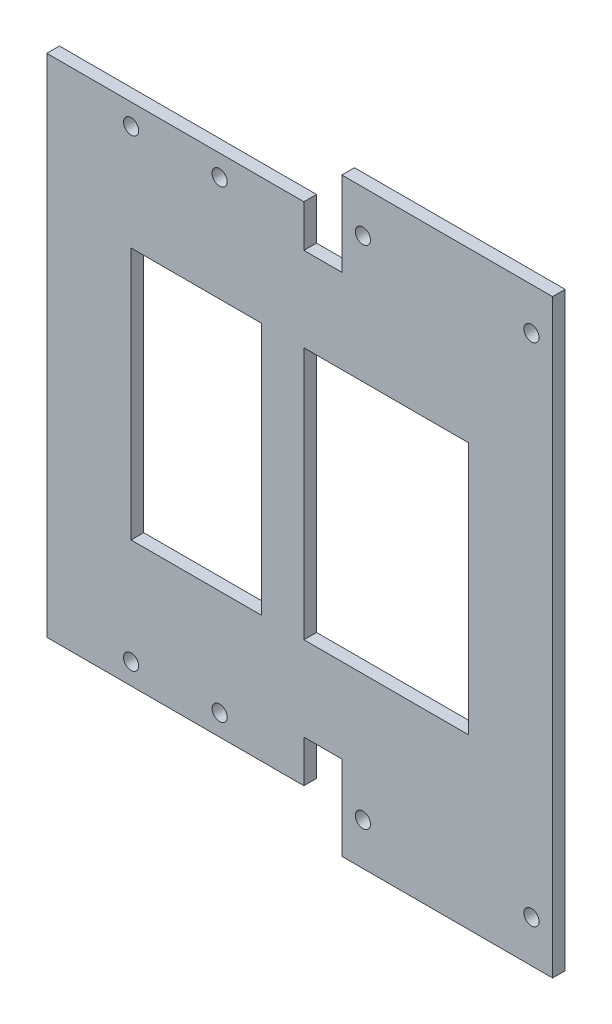
ISO-10303-21;
HEADER;
FILE_DESCRIPTION(('STEP AP214'),'2;1');
FILE_NAME('part.step','',(''),(''),'','','');
FILE_SCHEMA(('AUTOMOTIVE_DESIGN { 1 0 10303 214 1 1 1 1 }'));
ENDSEC;
DATA;
#1=APPLICATION_CONTEXT('core data for automotive mechanical design processes');
#2=APPLICATION_PROTOCOL_DEFINITION('international standard','automotive_design',2000,#1);
#3=PRODUCT_CONTEXT('',#1,'mechanical');
#4=PRODUCT('Part','Part','',(#3));
#5=PRODUCT_RELATED_PRODUCT_CATEGORY('part','',(#4));
#6=PRODUCT_DEFINITION_FORMATION('','',#4);
#7=PRODUCT_DEFINITION_CONTEXT('part definition',#1,'design');
#8=PRODUCT_DEFINITION('design','',#6,#7);
#9=PRODUCT_DEFINITION_SHAPE('','',#8);
#10=(LENGTH_UNIT() NAMED_UNIT(*) SI_UNIT(.MILLI.,.METRE.));
#11=(NAMED_UNIT(*) PLANE_ANGLE_UNIT() SI_UNIT($,.RADIAN.));
#12=(NAMED_UNIT(*) SI_UNIT($,.STERADIAN.) SOLID_ANGLE_UNIT());
#13=UNCERTAINTY_MEASURE_WITH_UNIT(LENGTH_MEASURE(1.E-05),#10,'distance_accuracy_value','');
#14=(GEOMETRIC_REPRESENTATION_CONTEXT(3) GLOBAL_UNCERTAINTY_ASSIGNED_CONTEXT((#13)) GLOBAL_UNIT_ASSIGNED_CONTEXT((#10,
#11,#12)) REPRESENTATION_CONTEXT('',''));
#15=CARTESIAN_POINT('',(0.,0.,0.));
#16=DIRECTION('',(0.,0.,1.));
#17=DIRECTION('',(1.,0.,0.));
#18=AXIS2_PLACEMENT_3D('',#15,#16,#17);
#19=CARTESIAN_POINT('',(20.,0.,3.));
#20=DIRECTION('',(-1.,0.,0.));
#21=DIRECTION('',(0.,-1.,0.));
#22=AXIS2_PLACEMENT_3D('',#19,#20,#21);
#23=PLANE('',#22);
#24=DIRECTION('',(0.,1.,0.));
#25=VECTOR('',#24,1.);
#26=CARTESIAN_POINT('',(20.,0.,0.));
#27=LINE('',#26,#25);
#28=CARTESIAN_POINT('',(20.,20.,0.));
#29=VERTEX_POINT('',#28);
#30=CARTESIAN_POINT('',(20.,80.,0.));
#31=VERTEX_POINT('',#30);
#32=EDGE_CURVE('E314',#29,#31,#27,.T.);
#33=ORIENTED_EDGE('',*,*,#32,.T.);
#34=DIRECTION('',(0.,0.,-1.));
#35=VECTOR('',#34,1.);
#36=CARTESIAN_POINT('',(20.,80.,3.));
#37=LINE('',#36,#35);
#38=CARTESIAN_POINT('',(20.,80.,3.));
#39=VERTEX_POINT('',#38);
#40=EDGE_CURVE('E11',#39,#31,#37,.T.);
#41=ORIENTED_EDGE('',*,*,#40,.F.);
#42=DIRECTION('',(0.,1.,0.));
#43=VECTOR('',#42,1.);
#44=CARTESIAN_POINT('',(20.,0.,3.));
#45=LINE('',#44,#43);
#46=CARTESIAN_POINT('',(20.,20.,3.));
#47=VERTEX_POINT('',#46);
#48=EDGE_CURVE('E198',#47,#39,#45,.T.);
#49=ORIENTED_EDGE('',*,*,#48,.F.);
#50=DIRECTION('',(0.,0.,-1.));
#51=VECTOR('',#50,1.);
#52=CARTESIAN_POINT('',(20.,20.,3.));
#53=LINE('',#52,#51);
#54=EDGE_CURVE('E65',#47,#29,#53,.T.);
#55=ORIENTED_EDGE('',*,*,#54,.T.);
#56=EDGE_LOOP('',(#33,#41,#49,#55));
#57=FACE_BOUND('',#56,.T.);
#58=ADVANCED_FACE('F45',(#57),#23,.F.);
#59=CARTESIAN_POINT('',(0.,80.,3.));
#60=DIRECTION('',(0.,1.,0.));
#61=DIRECTION('',(0.,0.,1.));
#62=AXIS2_PLACEMENT_3D('',#59,#60,#61);
#63=PLANE('',#62);
#64=DIRECTION('',(1.,0.,0.));
#65=VECTOR('',#64,1.);
#66=CARTESIAN_POINT('',(0.,80.,0.));
#67=LINE('',#66,#65);
#68=CARTESIAN_POINT('',(51.,80.,0.));
#69=VERTEX_POINT('',#68);
#70=EDGE_CURVE('E205',#31,#69,#67,.T.);
#71=ORIENTED_EDGE('',*,*,#70,.T.);
#72=DIRECTION('',(0.,0.,-1.));
#73=VECTOR('',#72,1.);
#74=CARTESIAN_POINT('',(51.,80.,3.));
#75=LINE('',#74,#73);
#76=CARTESIAN_POINT('',(51.,80.,3.));
#77=VERTEX_POINT('',#76);
#78=EDGE_CURVE('E56',#77,#69,#75,.T.);
#79=ORIENTED_EDGE('',*,*,#78,.F.);
#80=DIRECTION('',(1.,0.,0.));
#81=VECTOR('',#80,1.);
#82=CARTESIAN_POINT('',(0.,80.,3.));
#83=LINE('',#82,#81);
#84=EDGE_CURVE('E191',#39,#77,#83,.T.);
#85=ORIENTED_EDGE('',*,*,#84,.F.);
#86=ORIENTED_EDGE('',*,*,#40,.T.);
#87=EDGE_LOOP('',(#71,#79,#85,#86));
#88=FACE_BOUND('',#87,.T.);
#89=ADVANCED_FACE('F204',(#88),#63,.F.);
#90=CARTESIAN_POINT('',(51.,0.,3.));
#91=DIRECTION('',(-1.,0.,0.));
#92=DIRECTION('',(0.,-1.,0.));
#93=AXIS2_PLACEMENT_3D('',#90,#91,#92);
#94=PLANE('',#93);
#95=DIRECTION('',(0.,1.,0.));
#96=VECTOR('',#95,1.);
#97=CARTESIAN_POINT('',(51.,0.,0.));
#98=LINE('',#97,#96);
#99=CARTESIAN_POINT('',(51.,20.,0.));
#100=VERTEX_POINT('',#99);
#101=EDGE_CURVE('E319',#100,#69,#98,.T.);
#102=ORIENTED_EDGE('',*,*,#101,.F.);
#103=DIRECTION('',(0.,0.,-1.));
#104=VECTOR('',#103,1.);
#105=CARTESIAN_POINT('',(51.,20.,3.));
#106=LINE('',#105,#104);
#107=CARTESIAN_POINT('',(51.,20.,3.));
#108=VERTEX_POINT('',#107);
#109=EDGE_CURVE('E127',#108,#100,#106,.T.);
#110=ORIENTED_EDGE('',*,*,#109,.F.);
#111=DIRECTION('',(0.,1.,0.));
#112=VECTOR('',#111,1.);
#113=CARTESIAN_POINT('',(51.,0.,3.));
#114=LINE('',#113,#112);
#115=EDGE_CURVE('E197',#108,#77,#114,.T.);
#116=ORIENTED_EDGE('',*,*,#115,.T.);
#117=ORIENTED_EDGE('',*,*,#78,.T.);
#118=EDGE_LOOP('',(#102,#110,#116,#117));
#119=FACE_BOUND('',#118,.T.);
#120=ADVANCED_FACE('F210',(#119),#94,.T.);
#121=CARTESIAN_POINT('',(0.,100.,3.));
#122=DIRECTION('',(0.,1.,0.));
#123=DIRECTION('',(0.,0.,1.));
#124=AXIS2_PLACEMENT_3D('',#121,#122,#123);
#125=PLANE('',#124);
#126=DIRECTION('',(1.,0.,0.));
#127=VECTOR('',#126,1.);
#128=CARTESIAN_POINT('',(0.,100.,0.));
#129=LINE('',#128,#127);
#130=CARTESIAN_POINT('',(61.,100.,0.));
#131=VERTEX_POINT('',#130);
#132=CARTESIAN_POINT('',(70.,100.,0.));
#133=VERTEX_POINT('',#132);
#134=EDGE_CURVE('E266',#131,#133,#129,.T.);
#135=ORIENTED_EDGE('',*,*,#134,.F.);
#136=DIRECTION('',(0.,0.,-1.));
#137=VECTOR('',#136,1.);
#138=CARTESIAN_POINT('',(61.,100.,3.));
#139=LINE('',#138,#137);
#140=CARTESIAN_POINT('',(61.,100.,3.));
#141=VERTEX_POINT('',#140);
#142=EDGE_CURVE('E361',#141,#131,#139,.T.);
#143=ORIENTED_EDGE('',*,*,#142,.F.);
#144=DIRECTION('',(1.,0.,0.));
#145=VECTOR('',#144,1.);
#146=CARTESIAN_POINT('',(0.,100.,3.));
#147=LINE('',#146,#145);
#148=CARTESIAN_POINT('',(70.,100.,3.));
#149=VERTEX_POINT('',#148);
#150=EDGE_CURVE('E431',#141,#149,#147,.T.);
#151=ORIENTED_EDGE('',*,*,#150,.T.);
#152=DIRECTION('',(0.,0.,-1.));
#153=VECTOR('',#152,1.);
#154=CARTESIAN_POINT('',(70.,100.,3.));
#155=LINE('',#154,#153);
#156=EDGE_CURVE('E364',#149,#133,#155,.T.);
#157=ORIENTED_EDGE('',*,*,#156,.T.);
#158=EDGE_LOOP('',(#135,#143,#151,#157));
#159=FACE_BOUND('',#158,.T.);
#160=ADVANCED_FACE('F498',(#159),#125,.T.);
#161=CARTESIAN_POINT('',(61.,0.,3.));
#162=DIRECTION('',(-1.,0.,0.));
#163=DIRECTION('',(0.,0.,1.));
#164=AXIS2_PLACEMENT_3D('',#161,#162,#163);
#165=PLANE('',#164);
#166=DIRECTION('',(0.,1.,0.));
#167=VECTOR('',#166,1.);
#168=CARTESIAN_POINT('',(61.,0.,0.));
#169=LINE('',#168,#167);
#170=CARTESIAN_POINT('',(61.,110.,0.));
#171=VERTEX_POINT('',#170);
#172=EDGE_CURVE('E270',#131,#171,#169,.T.);
#173=ORIENTED_EDGE('',*,*,#172,.T.);
#174=DIRECTION('',(0.,0.,-1.));
#175=VECTOR('',#174,1.);
#176=CARTESIAN_POINT('',(61.,110.,3.));
#177=LINE('',#176,#175);
#178=CARTESIAN_POINT('',(61.,110.,3.));
#179=VERTEX_POINT('',#178);
#180=EDGE_CURVE('E396',#179,#171,#177,.T.);
#181=ORIENTED_EDGE('',*,*,#180,.F.);
#182=DIRECTION('',(0.,1.,0.));
#183=VECTOR('',#182,1.);
#184=CARTESIAN_POINT('',(61.,0.,3.));
#185=LINE('',#184,#183);
#186=EDGE_CURVE('E437',#141,#179,#185,.T.);
#187=ORIENTED_EDGE('',*,*,#186,.F.);
#188=ORIENTED_EDGE('',*,*,#142,.T.);
#189=EDGE_LOOP('',(#173,#181,#187,#188));
#190=FACE_BOUND('',#189,.T.);
#191=ADVANCED_FACE('F502',(#190),#165,.F.);
#192=CARTESIAN_POINT('',(0.,110.,3.));
#193=DIRECTION('',(0.,1.,0.));
#194=DIRECTION('',(0.,0.,1.));
#195=AXIS2_PLACEMENT_3D('',#192,#193,#194);
#196=PLANE('',#195);
#197=DIRECTION('',(1.,0.,0.));
#198=VECTOR('',#197,1.);
#199=CARTESIAN_POINT('',(0.,110.,0.));
#200=LINE('',#199,#198);
#201=CARTESIAN_POINT('',(0.,110.,0.));
#202=VERTEX_POINT('',#201);
#203=EDGE_CURVE('E274',#202,#171,#200,.T.);
#204=ORIENTED_EDGE('',*,*,#203,.F.);
#205=DIRECTION('',(0.,0.,-1.));
#206=VECTOR('',#205,1.);
#207=CARTESIAN_POINT('',(0.,110.,3.));
#208=LINE('',#207,#206);
#209=CARTESIAN_POINT('',(0.,110.,3.));
#210=VERTEX_POINT('',#209);
#211=EDGE_CURVE('E393',#210,#202,#208,.T.);
#212=ORIENTED_EDGE('',*,*,#211,.F.);
#213=DIRECTION('',(1.,0.,0.));
#214=VECTOR('',#213,1.);
#215=CARTESIAN_POINT('',(0.,110.,3.));
#216=LINE('',#215,#214);
#217=EDGE_CURVE('E444',#210,#179,#216,.T.);
#218=ORIENTED_EDGE('',*,*,#217,.T.);
#219=ORIENTED_EDGE('',*,*,#180,.T.);
#220=EDGE_LOOP('',(#204,#212,#218,#219));
#221=FACE_BOUND('',#220,.T.);
#222=ADVANCED_FACE('F532',(#221),#196,.T.);
#223=CARTESIAN_POINT('',(0.,0.,3.));
#224=DIRECTION('',(-1.,0.,0.));
#225=DIRECTION('',(0.,-1.,0.));
#226=AXIS2_PLACEMENT_3D('',#223,#224,#225);
#227=PLANE('',#226);
#228=DIRECTION('',(0.,1.,0.));
#229=VECTOR('',#228,1.);
#230=CARTESIAN_POINT('',(0.,0.,0.));
#231=LINE('',#230,#229);
#232=CARTESIAN_POINT('',(0.,-10.,0.));
#233=VERTEX_POINT('',#232);
#234=EDGE_CURVE('E278',#233,#202,#231,.T.);
#235=ORIENTED_EDGE('',*,*,#234,.F.);
#236=DIRECTION('',(0.,0.,-1.));
#237=VECTOR('',#236,1.);
#238=CARTESIAN_POINT('',(0.,-10.,3.));
#239=LINE('',#238,#237);
#240=CARTESIAN_POINT('',(0.,-10.,3.));
#241=VERTEX_POINT('',#240);
#242=EDGE_CURVE('E390',#241,#233,#239,.T.);
#243=ORIENTED_EDGE('',*,*,#242,.F.);
#244=DIRECTION('',(0.,1.,0.));
#245=VECTOR('',#244,1.);
#246=CARTESIAN_POINT('',(0.,0.,3.));
#247=LINE('',#246,#245);
#248=EDGE_CURVE('E448',#241,#210,#247,.T.);
#249=ORIENTED_EDGE('',*,*,#248,.T.);
#250=ORIENTED_EDGE('',*,*,#211,.T.);
#251=EDGE_LOOP('',(#235,#243,#249,#250));
#252=FACE_BOUND('',#251,.T.);
#253=ADVANCED_FACE('F508',(#252),#227,.T.);
#254=CARTESIAN_POINT('',(0.,-10.,3.));
#255=DIRECTION('',(0.,1.,0.));
#256=DIRECTION('',(-1.,0.,0.));
#257=AXIS2_PLACEMENT_3D('',#254,#255,#256);
#258=PLANE('',#257);
#259=DIRECTION('',(1.,0.,0.));
#260=VECTOR('',#259,1.);
#261=CARTESIAN_POINT('',(0.,-10.,0.));
#262=LINE('',#261,#260);
#263=CARTESIAN_POINT('',(61.,-9.99999999999998,0.));
#264=VERTEX_POINT('',#263);
#265=EDGE_CURVE('E282',#233,#264,#262,.T.);
#266=ORIENTED_EDGE('',*,*,#265,.T.);
#267=DIRECTION('',(0.,0.,-1.));
#268=VECTOR('',#267,1.);
#269=CARTESIAN_POINT('',(61.,-9.99999999999998,3.));
#270=LINE('',#269,#268);
#271=CARTESIAN_POINT('',(61.,-9.99999999999998,3.));
#272=VERTEX_POINT('',#271);
#273=EDGE_CURVE('E387',#272,#264,#270,.T.);
#274=ORIENTED_EDGE('',*,*,#273,.F.);
#275=DIRECTION('',(1.,0.,0.));
#276=VECTOR('',#275,1.);
#277=CARTESIAN_POINT('',(0.,-10.,3.));
#278=LINE('',#277,#276);
#279=EDGE_CURVE('E452',#241,#272,#278,.T.);
#280=ORIENTED_EDGE('',*,*,#279,.F.);
#281=ORIENTED_EDGE('',*,*,#242,.T.);
#282=EDGE_LOOP('',(#266,#274,#280,#281));
#283=FACE_BOUND('',#282,.T.);
#284=ADVANCED_FACE('F514',(#283),#258,.F.);
#285=CARTESIAN_POINT('',(61.,0.,3.));
#286=DIRECTION('',(1.,0.,0.));
#287=DIRECTION('',(0.,0.,-1.));
#288=AXIS2_PLACEMENT_3D('',#285,#286,#287);
#289=PLANE('',#288);
#290=DIRECTION('',(0.,-1.,0.));
#291=VECTOR('',#290,1.);
#292=CARTESIAN_POINT('',(61.,0.,0.));
#293=LINE('',#292,#291);
#294=CARTESIAN_POINT('',(61.,0.,0.));
#295=VERTEX_POINT('',#294);
#296=EDGE_CURVE('E286',#295,#264,#293,.T.);
#297=ORIENTED_EDGE('',*,*,#296,.F.);
#298=DIRECTION('',(0.,0.,-1.));
#299=VECTOR('',#298,1.);
#300=CARTESIAN_POINT('',(61.,0.,3.));
#301=LINE('',#300,#299);
#302=CARTESIAN_POINT('',(61.,0.,3.));
#303=VERTEX_POINT('',#302);
#304=EDGE_CURVE('E384',#303,#295,#301,.T.);
#305=ORIENTED_EDGE('',*,*,#304,.F.);
#306=DIRECTION('',(0.,-1.,0.));
#307=VECTOR('',#306,1.);
#308=CARTESIAN_POINT('',(61.,0.,3.));
#309=LINE('',#308,#307);
#310=EDGE_CURVE('E455',#303,#272,#309,.T.);
#311=ORIENTED_EDGE('',*,*,#310,.T.);
#312=ORIENTED_EDGE('',*,*,#273,.T.);
#313=EDGE_LOOP('',(#297,#305,#311,#312));
#314=FACE_BOUND('',#313,.T.);
#315=ADVANCED_FACE('F520',(#314),#289,.T.);
#316=CARTESIAN_POINT('',(0.,0.,3.));
#317=DIRECTION('',(0.,1.,0.));
#318=DIRECTION('',(-1.,0.,0.));
#319=AXIS2_PLACEMENT_3D('',#316,#317,#318);
#320=PLANE('',#319);
#321=DIRECTION('',(1.,0.,0.));
#322=VECTOR('',#321,1.);
#323=CARTESIAN_POINT('',(0.,0.,0.));
#324=LINE('',#323,#322);
#325=CARTESIAN_POINT('',(70.,0.,0.));
#326=VERTEX_POINT('',#325);
#327=EDGE_CURVE('E290',#295,#326,#324,.T.);
#328=ORIENTED_EDGE('',*,*,#327,.T.);
#329=DIRECTION('',(0.,0.,-1.));
#330=VECTOR('',#329,1.);
#331=CARTESIAN_POINT('',(70.,0.,3.));
#332=LINE('',#331,#330);
#333=CARTESIAN_POINT('',(70.,0.,3.));
#334=VERTEX_POINT('',#333);
#335=EDGE_CURVE('E380',#334,#326,#332,.T.);
#336=ORIENTED_EDGE('',*,*,#335,.F.);
#337=DIRECTION('',(1.,0.,0.));
#338=VECTOR('',#337,1.);
#339=CARTESIAN_POINT('',(0.,0.,3.));
#340=LINE('',#339,#338);
#341=EDGE_CURVE('E459',#303,#334,#340,.T.);
#342=ORIENTED_EDGE('',*,*,#341,.F.);
#343=ORIENTED_EDGE('',*,*,#304,.T.);
#344=EDGE_LOOP('',(#328,#336,#342,#343));
#345=FACE_BOUND('',#344,.T.);
#346=ADVANCED_FACE('F523',(#345),#320,.F.);
#347=CARTESIAN_POINT('',(70.,0.,3.));
#348=DIRECTION('',(1.,0.,0.));
#349=DIRECTION('',(0.,1.,0.));
#350=AXIS2_PLACEMENT_3D('',#347,#348,#349);
#351=PLANE('',#350);
#352=DIRECTION('',(0.,-1.,0.));
#353=VECTOR('',#352,1.);
#354=CARTESIAN_POINT('',(70.,0.,0.));
#355=LINE('',#354,#353);
#356=CARTESIAN_POINT('',(70.,-20.,0.));
#357=VERTEX_POINT('',#356);
#358=EDGE_CURVE('E294',#326,#357,#355,.T.);
#359=ORIENTED_EDGE('',*,*,#358,.T.);
#360=DIRECTION('',(0.,0.,-1.));
#361=VECTOR('',#360,1.);
#362=CARTESIAN_POINT('',(70.,-20.,3.));
#363=LINE('',#362,#361);
#364=CARTESIAN_POINT('',(70.,-20.,3.));
#365=VERTEX_POINT('',#364);
#366=EDGE_CURVE('E377',#365,#357,#363,.T.);
#367=ORIENTED_EDGE('',*,*,#366,.F.);
#368=DIRECTION('',(0.,-1.,0.));
#369=VECTOR('',#368,1.);
#370=CARTESIAN_POINT('',(70.,0.,3.));
#371=LINE('',#370,#369);
#372=EDGE_CURVE('E463',#334,#365,#371,.T.);
#373=ORIENTED_EDGE('',*,*,#372,.F.);
#374=ORIENTED_EDGE('',*,*,#335,.T.);
#375=EDGE_LOOP('',(#359,#367,#373,#374));
#376=FACE_BOUND('',#375,.T.);
#377=ADVANCED_FACE('F525',(#376),#351,.F.);
#378=CARTESIAN_POINT('',(0.,-20.,3.));
#379=DIRECTION('',(0.,-1.,0.));
#380=DIRECTION('',(1.,0.,0.));
#381=AXIS2_PLACEMENT_3D('',#378,#379,#380);
#382=PLANE('',#381);
#383=DIRECTION('',(-1.,0.,0.));
#384=VECTOR('',#383,1.);
#385=CARTESIAN_POINT('',(0.,-20.,0.));
#386=LINE('',#385,#384);
#387=CARTESIAN_POINT('',(120.,-20.,0.));
#388=VERTEX_POINT('',#387);
#389=EDGE_CURVE('E298',#388,#357,#386,.T.);
#390=ORIENTED_EDGE('',*,*,#389,.F.);
#391=DIRECTION('',(0.,0.,-1.));
#392=VECTOR('',#391,1.);
#393=CARTESIAN_POINT('',(120.,-20.,3.));
#394=LINE('',#393,#392);
#395=CARTESIAN_POINT('',(120.,-20.,3.));
#396=VERTEX_POINT('',#395);
#397=EDGE_CURVE('E374',#396,#388,#394,.T.);
#398=ORIENTED_EDGE('',*,*,#397,.F.);
#399=DIRECTION('',(-1.,0.,0.));
#400=VECTOR('',#399,1.);
#401=CARTESIAN_POINT('',(0.,-20.,3.));
#402=LINE('',#401,#400);
#403=EDGE_CURVE('E466',#396,#365,#402,.T.);
#404=ORIENTED_EDGE('',*,*,#403,.T.);
#405=ORIENTED_EDGE('',*,*,#366,.T.);
#406=EDGE_LOOP('',(#390,#398,#404,#405));
#407=FACE_BOUND('',#406,.T.);
#408=ADVANCED_FACE('F529',(#407),#382,.T.);
#409=CARTESIAN_POINT('',(120.,0.,3.));
#410=DIRECTION('',(-1.,0.,0.));
#411=DIRECTION('',(0.,-1.,0.));
#412=AXIS2_PLACEMENT_3D('',#409,#410,#411);
#413=PLANE('',#412);
#414=DIRECTION('',(0.,1.,0.));
#415=VECTOR('',#414,1.);
#416=CARTESIAN_POINT('',(120.,0.,0.));
#417=LINE('',#416,#415);
#418=CARTESIAN_POINT('',(120.,120.,0.));
#419=VERTEX_POINT('',#418);
#420=EDGE_CURVE('E302',#388,#419,#417,.T.);
#421=ORIENTED_EDGE('',*,*,#420,.T.);
#422=DIRECTION('',(0.,0.,-1.));
#423=VECTOR('',#422,1.);
#424=CARTESIAN_POINT('',(120.,120.,3.));
#425=LINE('',#424,#423);
#426=CARTESIAN_POINT('',(120.,120.,3.));
#427=VERTEX_POINT('',#426);
#428=EDGE_CURVE('E370',#427,#419,#425,.T.);
#429=ORIENTED_EDGE('',*,*,#428,.F.);
#430=DIRECTION('',(0.,1.,0.));
#431=VECTOR('',#430,1.);
#432=CARTESIAN_POINT('',(120.,0.,3.));
#433=LINE('',#432,#431);
#434=EDGE_CURVE('E470',#396,#427,#433,.T.);
#435=ORIENTED_EDGE('',*,*,#434,.F.);
#436=ORIENTED_EDGE('',*,*,#397,.T.);
#437=EDGE_LOOP('',(#421,#429,#435,#436));
#438=FACE_BOUND('',#437,.T.);
#439=ADVANCED_FACE('F531',(#438),#413,.F.);
#440=CARTESIAN_POINT('',(0.,120.,3.));
#441=DIRECTION('',(0.,-1.,0.));
#442=DIRECTION('',(1.,0.,0.));
#443=AXIS2_PLACEMENT_3D('',#440,#441,#442);
#444=PLANE('',#443);
#445=DIRECTION('',(-1.,0.,0.));
#446=VECTOR('',#445,1.);
#447=CARTESIAN_POINT('',(0.,120.,0.));
#448=LINE('',#447,#446);
#449=CARTESIAN_POINT('',(70.,120.,0.));
#450=VERTEX_POINT('',#449);
#451=EDGE_CURVE('E306',#419,#450,#448,.T.);
#452=ORIENTED_EDGE('',*,*,#451,.T.);
#453=DIRECTION('',(0.,0.,-1.));
#454=VECTOR('',#453,1.);
#455=CARTESIAN_POINT('',(70.,120.,3.));
#456=LINE('',#455,#454);
#457=CARTESIAN_POINT('',(70.,120.,3.));
#458=VERTEX_POINT('',#457);
#459=EDGE_CURVE('E367',#458,#450,#456,.T.);
#460=ORIENTED_EDGE('',*,*,#459,.F.);
#461=DIRECTION('',(-1.,0.,0.));
#462=VECTOR('',#461,1.);
#463=CARTESIAN_POINT('',(0.,120.,3.));
#464=LINE('',#463,#462);
#465=EDGE_CURVE('E474',#427,#458,#464,.T.);
#466=ORIENTED_EDGE('',*,*,#465,.F.);
#467=ORIENTED_EDGE('',*,*,#428,.T.);
#468=EDGE_LOOP('',(#452,#460,#466,#467));
#469=FACE_BOUND('',#468,.T.);
#470=ADVANCED_FACE('F492',(#469),#444,.F.);
#471=CARTESIAN_POINT('',(0.,80.,3.));
#472=DIRECTION('',(0.,-1.,0.));
#473=DIRECTION('',(0.,0.,-1.));
#474=AXIS2_PLACEMENT_3D('',#471,#472,#473);
#475=PLANE('',#474);
#476=DIRECTION('',(-1.,0.,0.));
#477=VECTOR('',#476,1.);
#478=CARTESIAN_POINT('',(0.,80.,0.));
#479=LINE('',#478,#477);
#480=CARTESIAN_POINT('',(100.,80.,0.));
#481=VERTEX_POINT('',#480);
#482=CARTESIAN_POINT('',(61.,80.,0.));
#483=VERTEX_POINT('',#482);
#484=EDGE_CURVE('E251',#481,#483,#479,.T.);
#485=ORIENTED_EDGE('',*,*,#484,.F.);
#486=DIRECTION('',(0.,0.,-1.));
#487=VECTOR('',#486,1.);
#488=CARTESIAN_POINT('',(100.,80.,3.));
#489=LINE('',#488,#487);
#490=CARTESIAN_POINT('',(100.,80.,3.));
#491=VERTEX_POINT('',#490);
#492=EDGE_CURVE('E49',#491,#481,#489,.T.);
#493=ORIENTED_EDGE('',*,*,#492,.F.);
#494=DIRECTION('',(-1.,0.,0.));
#495=VECTOR('',#494,1.);
#496=CARTESIAN_POINT('',(0.,80.,3.));
#497=LINE('',#496,#495);
#498=CARTESIAN_POINT('',(61.,80.,3.));
#499=VERTEX_POINT('',#498);
#500=EDGE_CURVE('E358',#491,#499,#497,.T.);
#501=ORIENTED_EDGE('',*,*,#500,.T.);
#502=DIRECTION('',(0.,0.,-1.));
#503=VECTOR('',#502,1.);
#504=CARTESIAN_POINT('',(61.,80.,3.));
#505=LINE('',#504,#503);
#506=EDGE_CURVE('E250',#499,#483,#505,.T.);
#507=ORIENTED_EDGE('',*,*,#506,.T.);
#508=EDGE_LOOP('',(#485,#493,#501,#507));
#509=FACE_BOUND('',#508,.T.);
#510=ADVANCED_FACE('F47',(#509),#475,.T.);
#511=CARTESIAN_POINT('',(100.,0.,3.));
#512=DIRECTION('',(-1.,0.,0.));
#513=DIRECTION('',(0.,-1.,0.));
#514=AXIS2_PLACEMENT_3D('',#511,#512,#513);
#515=PLANE('',#514);
#516=DIRECTION('',(0.,1.,0.));
#517=VECTOR('',#516,1.);
#518=CARTESIAN_POINT('',(100.,0.,0.));
#519=LINE('',#518,#517);
#520=CARTESIAN_POINT('',(100.,20.,0.));
#521=VERTEX_POINT('',#520);
#522=EDGE_CURVE('E255',#521,#481,#519,.T.);
#523=ORIENTED_EDGE('',*,*,#522,.F.);
#524=DIRECTION('',(0.,0.,-1.));
#525=VECTOR('',#524,1.);
#526=CARTESIAN_POINT('',(100.,20.,3.));
#527=LINE('',#526,#525);
#528=CARTESIAN_POINT('',(100.,20.,3.));
#529=VERTEX_POINT('',#528);
#530=EDGE_CURVE('E406',#529,#521,#527,.T.);
#531=ORIENTED_EDGE('',*,*,#530,.F.);
#532=DIRECTION('',(0.,1.,0.));
#533=VECTOR('',#532,1.);
#534=CARTESIAN_POINT('',(100.,0.,3.));
#535=LINE('',#534,#533);
#536=EDGE_CURVE('E417',#529,#491,#535,.T.);
#537=ORIENTED_EDGE('',*,*,#536,.T.);
#538=ORIENTED_EDGE('',*,*,#492,.T.);
#539=EDGE_LOOP('',(#523,#531,#537,#538));
#540=FACE_BOUND('',#539,.T.);
#541=ADVANCED_FACE('F415',(#540),#515,.T.);
#542=CARTESIAN_POINT('',(0.,20.,3.));
#543=DIRECTION('',(0.,-1.,0.));
#544=DIRECTION('',(1.,0.,0.));
#545=AXIS2_PLACEMENT_3D('',#542,#543,#544);
#546=PLANE('',#545);
#547=DIRECTION('',(-1.,0.,0.));
#548=VECTOR('',#547,1.);
#549=CARTESIAN_POINT('',(0.,20.,0.));
#550=LINE('',#549,#548);
#551=CARTESIAN_POINT('',(61.,20.,0.));
#552=VERTEX_POINT('',#551);
#553=EDGE_CURVE('E259',#521,#552,#550,.T.);
#554=ORIENTED_EDGE('',*,*,#553,.T.);
#555=DIRECTION('',(0.,0.,-1.));
#556=VECTOR('',#555,1.);
#557=CARTESIAN_POINT('',(61.,20.,3.));
#558=LINE('',#557,#556);
#559=CARTESIAN_POINT('',(61.,20.,3.));
#560=VERTEX_POINT('',#559);
#561=EDGE_CURVE('E403',#560,#552,#558,.T.);
#562=ORIENTED_EDGE('',*,*,#561,.F.);
#563=DIRECTION('',(-1.,0.,0.));
#564=VECTOR('',#563,1.);
#565=CARTESIAN_POINT('',(0.,20.,3.));
#566=LINE('',#565,#564);
#567=EDGE_CURVE('E432',#529,#560,#566,.T.);
#568=ORIENTED_EDGE('',*,*,#567,.F.);
#569=ORIENTED_EDGE('',*,*,#530,.T.);
#570=EDGE_LOOP('',(#554,#562,#568,#569));
#571=FACE_BOUND('',#570,.T.);
#572=ADVANCED_FACE('F424',(#571),#546,.F.);
#573=CARTESIAN_POINT('',(41.,105.,3.));
#574=DIRECTION('',(0.,0.,-1.));
#575=DIRECTION('',(-1.,0.,0.));
#576=AXIS2_PLACEMENT_3D('',#573,#574,#575);
#577=CYLINDRICAL_SURFACE('',#576,1.79999999999999);
#578=CARTESIAN_POINT('',(41.,105.,3.));
#579=DIRECTION('',(0.,0.,1.));
#580=DIRECTION('',(1.,0.,0.));
#581=AXIS2_PLACEMENT_3D('',#578,#579,#580);
#582=CIRCLE('',#581,1.79999999999999);
#583=CARTESIAN_POINT('',(42.8,105.,3.));
#584=VERTEX_POINT('',#583);
#585=EDGE_CURVE('E242',#584,#584,#582,.T.);
#586=ORIENTED_EDGE('',*,*,#585,.T.);
#587=EDGE_LOOP('',(#586));
#588=FACE_BOUND('',#587,.T.);
#589=CARTESIAN_POINT('',(41.,105.,0.));
#590=DIRECTION('',(0.,0.,1.));
#591=DIRECTION('',(1.,0.,0.));
#592=AXIS2_PLACEMENT_3D('',#589,#590,#591);
#593=CIRCLE('',#592,1.79999999999999);
#594=CARTESIAN_POINT('',(42.8,105.,0.));
#595=VERTEX_POINT('',#594);
#596=EDGE_CURVE('E350',#595,#595,#593,.T.);
#597=ORIENTED_EDGE('',*,*,#596,.F.);
#598=EDGE_LOOP('',(#597));
#599=FACE_BOUND('',#598,.T.);
#600=ADVANCED_FACE('F609',(#588,#599),#577,.F.);
#601=CARTESIAN_POINT('',(75.,110.,3.));
#602=DIRECTION('',(0.,0.,-1.));
#603=DIRECTION('',(-1.,0.,0.));
#604=AXIS2_PLACEMENT_3D('',#601,#602,#603);
#605=CYLINDRICAL_SURFACE('',#604,1.79999999999999);
#606=CARTESIAN_POINT('',(75.,110.,3.));
#607=DIRECTION('',(0.,0.,1.));
#608=DIRECTION('',(1.,0.,0.));
#609=AXIS2_PLACEMENT_3D('',#606,#607,#608);
#610=CIRCLE('',#609,1.79999999999999);
#611=CARTESIAN_POINT('',(76.8,110.,3.));
#612=VERTEX_POINT('',#611);
#613=EDGE_CURVE('E238',#612,#612,#610,.T.);
#614=ORIENTED_EDGE('',*,*,#613,.T.);
#615=EDGE_LOOP('',(#614));
#616=FACE_BOUND('',#615,.T.);
#617=CARTESIAN_POINT('',(75.,110.,0.));
#618=DIRECTION('',(0.,0.,1.));
#619=DIRECTION('',(1.,0.,0.));
#620=AXIS2_PLACEMENT_3D('',#617,#618,#619);
#621=CIRCLE('',#620,1.79999999999999);
#622=CARTESIAN_POINT('',(76.8,110.,0.));
#623=VERTEX_POINT('',#622);
#624=EDGE_CURVE('E346',#623,#623,#621,.T.);
#625=ORIENTED_EDGE('',*,*,#624,.F.);
#626=EDGE_LOOP('',(#625));
#627=FACE_BOUND('',#626,.T.);
#628=ADVANCED_FACE('F616',(#616,#627),#605,.F.);
#629=CARTESIAN_POINT('',(115.,110.,3.));
#630=DIRECTION('',(0.,0.,-1.));
#631=DIRECTION('',(-1.,0.,0.));
#632=AXIS2_PLACEMENT_3D('',#629,#630,#631);
#633=CYLINDRICAL_SURFACE('',#632,1.79999999999999);
#634=CARTESIAN_POINT('',(115.,110.,3.));
#635=DIRECTION('',(0.,0.,1.));
#636=DIRECTION('',(1.,0.,0.));
#637=AXIS2_PLACEMENT_3D('',#634,#635,#636);
#638=CIRCLE('',#637,1.79999999999999);
#639=CARTESIAN_POINT('',(116.8,110.,3.));
#640=VERTEX_POINT('',#639);
#641=EDGE_CURVE('E234',#640,#640,#638,.T.);
#642=ORIENTED_EDGE('',*,*,#641,.T.);
#643=EDGE_LOOP('',(#642));
#644=FACE_BOUND('',#643,.T.);
#645=CARTESIAN_POINT('',(115.,110.,0.));
#646=DIRECTION('',(0.,0.,1.));
#647=DIRECTION('',(1.,0.,0.));
#648=AXIS2_PLACEMENT_3D('',#645,#646,#647);
#649=CIRCLE('',#648,1.79999999999999);
#650=CARTESIAN_POINT('',(116.8,110.,0.));
#651=VERTEX_POINT('',#650);
#652=EDGE_CURVE('E342',#651,#651,#649,.T.);
#653=ORIENTED_EDGE('',*,*,#652,.F.);
#654=EDGE_LOOP('',(#653));
#655=FACE_BOUND('',#654,.T.);
#656=ADVANCED_FACE('F624',(#644,#655),#633,.F.);
#657=CARTESIAN_POINT('',(20.,-4.99999999999999,3.));
#658=DIRECTION('',(0.,0.,-1.));
#659=DIRECTION('',(-1.,0.,0.));
#660=AXIS2_PLACEMENT_3D('',#657,#658,#659);
#661=CYLINDRICAL_SURFACE('',#660,1.8);
#662=CARTESIAN_POINT('',(20.,-4.99999999999999,3.));
#663=DIRECTION('',(0.,0.,1.));
#664=DIRECTION('',(1.,0.,0.));
#665=AXIS2_PLACEMENT_3D('',#662,#663,#664);
#666=CIRCLE('',#665,1.8);
#667=CARTESIAN_POINT('',(21.8,-4.99999999999999,3.));
#668=VERTEX_POINT('',#667);
#669=EDGE_CURVE('E230',#668,#668,#666,.T.);
#670=ORIENTED_EDGE('',*,*,#669,.T.);
#671=EDGE_LOOP('',(#670));
#672=FACE_BOUND('',#671,.T.);
#673=CARTESIAN_POINT('',(20.,-4.99999999999999,0.));
#674=DIRECTION('',(0.,0.,1.));
#675=DIRECTION('',(1.,0.,0.));
#676=AXIS2_PLACEMENT_3D('',#673,#674,#675);
#677=CIRCLE('',#676,1.8);
#678=CARTESIAN_POINT('',(21.8,-4.99999999999999,0.));
#679=VERTEX_POINT('',#678);
#680=EDGE_CURVE('E338',#679,#679,#677,.T.);
#681=ORIENTED_EDGE('',*,*,#680,.F.);
#682=EDGE_LOOP('',(#681));
#683=FACE_BOUND('',#682,.T.);
#684=ADVANCED_FACE('F632',(#672,#683),#661,.F.);
#685=CARTESIAN_POINT('',(41.,-4.99999999999999,3.));
#686=DIRECTION('',(0.,0.,-1.));
#687=DIRECTION('',(-1.,0.,0.));
#688=AXIS2_PLACEMENT_3D('',#685,#686,#687);
#689=CYLINDRICAL_SURFACE('',#688,1.8);
#690=CARTESIAN_POINT('',(41.,-4.99999999999999,3.));
#691=DIRECTION('',(0.,0.,1.));
#692=DIRECTION('',(1.,0.,0.));
#693=AXIS2_PLACEMENT_3D('',#690,#691,#692);
#694=CIRCLE('',#693,1.8);
#695=CARTESIAN_POINT('',(42.8,-4.99999999999999,3.));
#696=VERTEX_POINT('',#695);
#697=EDGE_CURVE('E226',#696,#696,#694,.T.);
#698=ORIENTED_EDGE('',*,*,#697,.T.);
#699=EDGE_LOOP('',(#698));
#700=FACE_BOUND('',#699,.T.);
#701=CARTESIAN_POINT('',(41.,-4.99999999999999,0.));
#702=DIRECTION('',(0.,0.,1.));
#703=DIRECTION('',(1.,0.,0.));
#704=AXIS2_PLACEMENT_3D('',#701,#702,#703);
#705=CIRCLE('',#704,1.8);
#706=CARTESIAN_POINT('',(42.8,-4.99999999999999,0.));
#707=VERTEX_POINT('',#706);
#708=EDGE_CURVE('E334',#707,#707,#705,.T.);
#709=ORIENTED_EDGE('',*,*,#708,.F.);
#710=EDGE_LOOP('',(#709));
#711=FACE_BOUND('',#710,.T.);
#712=ADVANCED_FACE('F640',(#700,#711),#689,.F.);
#713=CARTESIAN_POINT('',(75.,-9.99999999999999,3.));
#714=DIRECTION('',(0.,0.,-1.));
#715=DIRECTION('',(-1.,0.,0.));
#716=AXIS2_PLACEMENT_3D('',#713,#714,#715);
#717=CYLINDRICAL_SURFACE('',#716,1.79999999999999);
#718=CARTESIAN_POINT('',(75.,-9.99999999999999,3.));
#719=DIRECTION('',(0.,0.,1.));
#720=DIRECTION('',(1.,0.,0.));
#721=AXIS2_PLACEMENT_3D('',#718,#719,#720);
#722=CIRCLE('',#721,1.79999999999999);
#723=CARTESIAN_POINT('',(76.8,-9.99999999999999,3.));
#724=VERTEX_POINT('',#723);
#725=EDGE_CURVE('E222',#724,#724,#722,.T.);
#726=ORIENTED_EDGE('',*,*,#725,.T.);
#727=EDGE_LOOP('',(#726));
#728=FACE_BOUND('',#727,.T.);
#729=CARTESIAN_POINT('',(75.,-9.99999999999999,0.));
#730=DIRECTION('',(0.,0.,1.));
#731=DIRECTION('',(1.,0.,0.));
#732=AXIS2_PLACEMENT_3D('',#729,#730,#731);
#733=CIRCLE('',#732,1.79999999999999);
#734=CARTESIAN_POINT('',(76.8,-9.99999999999999,0.));
#735=VERTEX_POINT('',#734);
#736=EDGE_CURVE('E330',#735,#735,#733,.T.);
#737=ORIENTED_EDGE('',*,*,#736,.F.);
#738=EDGE_LOOP('',(#737));
#739=FACE_BOUND('',#738,.T.);
#740=ADVANCED_FACE('F648',(#728,#739),#717,.F.);
#741=CARTESIAN_POINT('',(115.,-9.99999999999999,3.));
#742=DIRECTION('',(0.,0.,-1.));
#743=DIRECTION('',(-1.,0.,0.));
#744=AXIS2_PLACEMENT_3D('',#741,#742,#743);
#745=CYLINDRICAL_SURFACE('',#744,1.79999999999999);
#746=CARTESIAN_POINT('',(115.,-9.99999999999999,3.));
#747=DIRECTION('',(0.,0.,1.));
#748=DIRECTION('',(1.,0.,0.));
#749=AXIS2_PLACEMENT_3D('',#746,#747,#748);
#750=CIRCLE('',#749,1.79999999999999);
#751=CARTESIAN_POINT('',(116.8,-9.99999999999999,3.));
#752=VERTEX_POINT('',#751);
#753=EDGE_CURVE('E215',#752,#752,#750,.T.);
#754=ORIENTED_EDGE('',*,*,#753,.T.);
#755=EDGE_LOOP('',(#754));
#756=FACE_BOUND('',#755,.T.);
#757=CARTESIAN_POINT('',(115.,-9.99999999999999,0.));
#758=DIRECTION('',(0.,0.,1.));
#759=DIRECTION('',(1.,0.,0.));
#760=AXIS2_PLACEMENT_3D('',#757,#758,#759);
#761=CIRCLE('',#760,1.79999999999999);
#762=CARTESIAN_POINT('',(116.8,-9.99999999999999,0.));
#763=VERTEX_POINT('',#762);
#764=EDGE_CURVE('E326',#763,#763,#761,.T.);
#765=ORIENTED_EDGE('',*,*,#764,.F.);
#766=EDGE_LOOP('',(#765));
#767=FACE_BOUND('',#766,.T.);
#768=ADVANCED_FACE('F656',(#756,#767),#745,.F.);
#769=CARTESIAN_POINT('',(0.,20.,3.));
#770=DIRECTION('',(0.,1.,0.));
#771=DIRECTION('',(-1.,0.,0.));
#772=AXIS2_PLACEMENT_3D('',#769,#770,#771);
#773=PLANE('',#772);
#774=DIRECTION('',(1.,0.,0.));
#775=VECTOR('',#774,1.);
#776=CARTESIAN_POINT('',(0.,20.,0.));
#777=LINE('',#776,#775);
#778=EDGE_CURVE('E322',#29,#100,#777,.T.);
#779=ORIENTED_EDGE('',*,*,#778,.F.);
#780=ORIENTED_EDGE('',*,*,#54,.F.);
#781=DIRECTION('',(1.,0.,0.));
#782=VECTOR('',#781,1.);
#783=CARTESIAN_POINT('',(0.,20.,3.));
#784=LINE('',#783,#782);
#785=EDGE_CURVE('E212',#47,#108,#784,.T.);
#786=ORIENTED_EDGE('',*,*,#785,.T.);
#787=ORIENTED_EDGE('',*,*,#109,.T.);
#788=EDGE_LOOP('',(#779,#780,#786,#787));
#789=FACE_BOUND('',#788,.T.);
#790=ADVANCED_FACE('F551',(#789),#773,.T.);
#791=CARTESIAN_POINT('',(70.,0.,3.));
#792=DIRECTION('',(-1.,0.,0.));
#793=DIRECTION('',(0.,0.,1.));
#794=AXIS2_PLACEMENT_3D('',#791,#792,#793);
#795=PLANE('',#794);
#796=DIRECTION('',(0.,1.,0.));
#797=VECTOR('',#796,1.);
#798=CARTESIAN_POINT('',(70.,0.,0.));
#799=LINE('',#798,#797);
#800=EDGE_CURVE('E310',#133,#450,#799,.T.);
#801=ORIENTED_EDGE('',*,*,#800,.F.);
#802=ORIENTED_EDGE('',*,*,#156,.F.);
#803=DIRECTION('',(0.,1.,0.));
#804=VECTOR('',#803,1.);
#805=CARTESIAN_POINT('',(70.,0.,3.));
#806=LINE('',#805,#804);
#807=EDGE_CURVE('E477',#149,#458,#806,.T.);
#808=ORIENTED_EDGE('',*,*,#807,.T.);
#809=ORIENTED_EDGE('',*,*,#459,.T.);
#810=EDGE_LOOP('',(#801,#802,#808,#809));
#811=FACE_BOUND('',#810,.T.);
#812=ADVANCED_FACE('F484',(#811),#795,.T.);
#813=CARTESIAN_POINT('',(61.,0.,3.));
#814=DIRECTION('',(-1.,0.,0.));
#815=DIRECTION('',(0.,-1.,0.));
#816=AXIS2_PLACEMENT_3D('',#813,#814,#815);
#817=PLANE('',#816);
#818=DIRECTION('',(0.,1.,0.));
#819=VECTOR('',#818,1.);
#820=CARTESIAN_POINT('',(61.,0.,0.));
#821=LINE('',#820,#819);
#822=EDGE_CURVE('E262',#552,#483,#821,.T.);
#823=ORIENTED_EDGE('',*,*,#822,.T.);
#824=ORIENTED_EDGE('',*,*,#506,.F.);
#825=DIRECTION('',(0.,1.,0.));
#826=VECTOR('',#825,1.);
#827=CARTESIAN_POINT('',(61.,0.,3.));
#828=LINE('',#827,#826);
#829=EDGE_CURVE('E428',#560,#499,#828,.T.);
#830=ORIENTED_EDGE('',*,*,#829,.F.);
#831=ORIENTED_EDGE('',*,*,#561,.T.);
#832=EDGE_LOOP('',(#823,#824,#830,#831));
#833=FACE_BOUND('',#832,.T.);
#834=ADVANCED_FACE('F427',(#833),#817,.F.);
#835=CARTESIAN_POINT('',(20.,105.,3.));
#836=DIRECTION('',(0.,0.,-1.));
#837=DIRECTION('',(-1.,0.,0.));
#838=AXIS2_PLACEMENT_3D('',#835,#836,#837);
#839=CYLINDRICAL_SURFACE('',#838,1.8);
#840=CARTESIAN_POINT('',(20.,105.,3.));
#841=DIRECTION('',(0.,0.,1.));
#842=DIRECTION('',(1.,0.,0.));
#843=AXIS2_PLACEMENT_3D('',#840,#841,#842);
#844=CIRCLE('',#843,1.8);
#845=CARTESIAN_POINT('',(21.8,105.,3.));
#846=VERTEX_POINT('',#845);
#847=EDGE_CURVE('E246',#846,#846,#844,.T.);
#848=ORIENTED_EDGE('',*,*,#847,.T.);
#849=EDGE_LOOP('',(#848));
#850=FACE_BOUND('',#849,.T.);
#851=CARTESIAN_POINT('',(20.,105.,0.));
#852=DIRECTION('',(0.,0.,1.));
#853=DIRECTION('',(1.,0.,0.));
#854=AXIS2_PLACEMENT_3D('',#851,#852,#853);
#855=CIRCLE('',#854,1.8);
#856=CARTESIAN_POINT('',(21.8,105.,0.));
#857=VERTEX_POINT('',#856);
#858=EDGE_CURVE('E354',#857,#857,#855,.T.);
#859=ORIENTED_EDGE('',*,*,#858,.F.);
#860=EDGE_LOOP('',(#859));
#861=FACE_BOUND('',#860,.T.);
#862=ADVANCED_FACE('F681',(#850,#861),#839,.F.);
#863=CARTESIAN_POINT('',(0.,0.,3.));
#864=DIRECTION('',(0.,0.,1.));
#865=DIRECTION('',(1.,0.,0.));
#866=AXIS2_PLACEMENT_3D('',#863,#864,#865);
#867=PLANE('',#866);
#868=ORIENTED_EDGE('',*,*,#500,.F.);
#869=ORIENTED_EDGE('',*,*,#536,.F.);
#870=ORIENTED_EDGE('',*,*,#567,.T.);
#871=ORIENTED_EDGE('',*,*,#829,.T.);
#872=EDGE_LOOP('',(#868,#869,#870,#871));
#873=FACE_BOUND('',#872,.T.);
#874=ORIENTED_EDGE('',*,*,#150,.F.);
#875=ORIENTED_EDGE('',*,*,#186,.T.);
#876=ORIENTED_EDGE('',*,*,#217,.F.);
#877=ORIENTED_EDGE('',*,*,#248,.F.);
#878=ORIENTED_EDGE('',*,*,#279,.T.);
#879=ORIENTED_EDGE('',*,*,#310,.F.);
#880=ORIENTED_EDGE('',*,*,#341,.T.);
#881=ORIENTED_EDGE('',*,*,#372,.T.);
#882=ORIENTED_EDGE('',*,*,#403,.F.);
#883=ORIENTED_EDGE('',*,*,#434,.T.);
#884=ORIENTED_EDGE('',*,*,#465,.T.);
#885=ORIENTED_EDGE('',*,*,#807,.F.);
#886=EDGE_LOOP('',(#874,#875,#876,#877,#878,#879,#880,#881,#882,#883,#884,#885));
#887=FACE_BOUND('',#886,.T.);
#888=ORIENTED_EDGE('',*,*,#48,.T.);
#889=ORIENTED_EDGE('',*,*,#84,.T.);
#890=ORIENTED_EDGE('',*,*,#115,.F.);
#891=ORIENTED_EDGE('',*,*,#785,.F.);
#892=EDGE_LOOP('',(#888,#889,#890,#891));
#893=FACE_BOUND('',#892,.T.);
#894=ORIENTED_EDGE('',*,*,#753,.F.);
#895=EDGE_LOOP('',(#894));
#896=FACE_BOUND('',#895,.T.);
#897=ORIENTED_EDGE('',*,*,#725,.F.);
#898=EDGE_LOOP('',(#897));
#899=FACE_BOUND('',#898,.T.);
#900=ORIENTED_EDGE('',*,*,#697,.F.);
#901=EDGE_LOOP('',(#900));
#902=FACE_BOUND('',#901,.T.);
#903=ORIENTED_EDGE('',*,*,#669,.F.);
#904=EDGE_LOOP('',(#903));
#905=FACE_BOUND('',#904,.T.);
#906=ORIENTED_EDGE('',*,*,#641,.F.);
#907=EDGE_LOOP('',(#906));
#908=FACE_BOUND('',#907,.T.);
#909=ORIENTED_EDGE('',*,*,#613,.F.);
#910=EDGE_LOOP('',(#909));
#911=FACE_BOUND('',#910,.T.);
#912=ORIENTED_EDGE('',*,*,#585,.F.);
#913=EDGE_LOOP('',(#912));
#914=FACE_BOUND('',#913,.T.);
#915=ORIENTED_EDGE('',*,*,#847,.F.);
#916=EDGE_LOOP('',(#915));
#917=FACE_BOUND('',#916,.T.);
#918=ADVANCED_FACE('F193',(#873,#887,#893,#896,#899,#902,#905,#908,#911,#914,#917),#867,.T.);
#919=CARTESIAN_POINT('',(0.,0.,0.));
#920=DIRECTION('',(0.,0.,1.));
#921=DIRECTION('',(1.,0.,0.));
#922=AXIS2_PLACEMENT_3D('',#919,#920,#921);
#923=PLANE('',#922);
#924=ORIENTED_EDGE('',*,*,#484,.T.);
#925=ORIENTED_EDGE('',*,*,#822,.F.);
#926=ORIENTED_EDGE('',*,*,#553,.F.);
#927=ORIENTED_EDGE('',*,*,#522,.T.);
#928=EDGE_LOOP('',(#924,#925,#926,#927));
#929=FACE_BOUND('',#928,.T.);
#930=ORIENTED_EDGE('',*,*,#134,.T.);
#931=ORIENTED_EDGE('',*,*,#800,.T.);
#932=ORIENTED_EDGE('',*,*,#451,.F.);
#933=ORIENTED_EDGE('',*,*,#420,.F.);
#934=ORIENTED_EDGE('',*,*,#389,.T.);
#935=ORIENTED_EDGE('',*,*,#358,.F.);
#936=ORIENTED_EDGE('',*,*,#327,.F.);
#937=ORIENTED_EDGE('',*,*,#296,.T.);
#938=ORIENTED_EDGE('',*,*,#265,.F.);
#939=ORIENTED_EDGE('',*,*,#234,.T.);
#940=ORIENTED_EDGE('',*,*,#203,.T.);
#941=ORIENTED_EDGE('',*,*,#172,.F.);
#942=EDGE_LOOP('',(#930,#931,#932,#933,#934,#935,#936,#937,#938,#939,#940,#941));
#943=FACE_BOUND('',#942,.T.);
#944=ORIENTED_EDGE('',*,*,#32,.F.);
#945=ORIENTED_EDGE('',*,*,#778,.T.);
#946=ORIENTED_EDGE('',*,*,#101,.T.);
#947=ORIENTED_EDGE('',*,*,#70,.F.);
#948=EDGE_LOOP('',(#944,#945,#946,#947));
#949=FACE_BOUND('',#948,.T.);
#950=ORIENTED_EDGE('',*,*,#764,.T.);
#951=EDGE_LOOP('',(#950));
#952=FACE_BOUND('',#951,.T.);
#953=ORIENTED_EDGE('',*,*,#736,.T.);
#954=EDGE_LOOP('',(#953));
#955=FACE_BOUND('',#954,.T.);
#956=ORIENTED_EDGE('',*,*,#708,.T.);
#957=EDGE_LOOP('',(#956));
#958=FACE_BOUND('',#957,.T.);
#959=ORIENTED_EDGE('',*,*,#680,.T.);
#960=EDGE_LOOP('',(#959));
#961=FACE_BOUND('',#960,.T.);
#962=ORIENTED_EDGE('',*,*,#652,.T.);
#963=EDGE_LOOP('',(#962));
#964=FACE_BOUND('',#963,.T.);
#965=ORIENTED_EDGE('',*,*,#624,.T.);
#966=EDGE_LOOP('',(#965));
#967=FACE_BOUND('',#966,.T.);
#968=ORIENTED_EDGE('',*,*,#596,.T.);
#969=EDGE_LOOP('',(#968));
#970=FACE_BOUND('',#969,.T.);
#971=ORIENTED_EDGE('',*,*,#858,.T.);
#972=EDGE_LOOP('',(#971));
#973=FACE_BOUND('',#972,.T.);
#974=ADVANCED_FACE('F421',(#929,#943,#949,#952,#955,#958,#961,#964,#967,#970,#973),#923,.F.);
#975=CLOSED_SHELL('',(#58,#89,#120,#160,#191,#222,#253,#284,#315,#346,#377,#408,#439,#470,#510,
#541,#572,#600,#628,#656,#684,#712,#740,#768,#790,#812,#834,#862,#918,#974));
#976=MANIFOLD_SOLID_BREP('B2',#975);
#977=ADVANCED_BREP_SHAPE_REPRESENTATION('',(#18,#976),#14);
#978=SHAPE_DEFINITION_REPRESENTATION(#9,#977);
ENDSEC;
END-ISO-10303-21;
